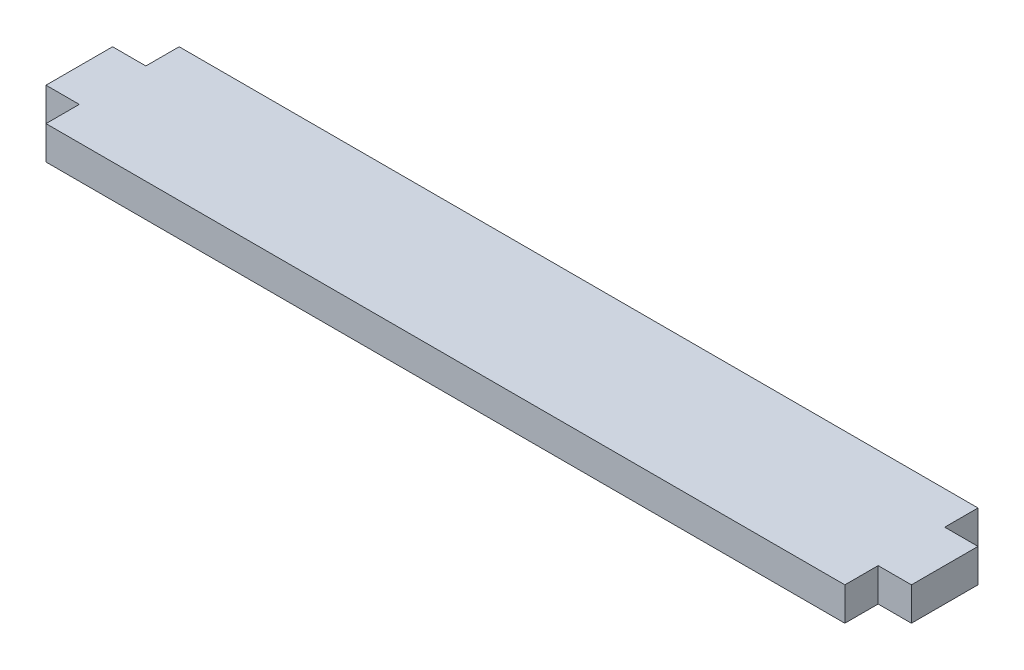
ISO-10303-21;
HEADER;
FILE_DESCRIPTION(('STEP AP214'),'2;1');
FILE_NAME('part.step','',(''),(''),'','','');
FILE_SCHEMA(('AUTOMOTIVE_DESIGN { 1 0 10303 214 1 1 1 1 }'));
ENDSEC;
DATA;
#1=APPLICATION_CONTEXT('core data for automotive mechanical design processes');
#2=APPLICATION_PROTOCOL_DEFINITION('international standard','automotive_design',2000,#1);
#3=PRODUCT_CONTEXT('',#1,'mechanical');
#4=PRODUCT('Part','Part','',(#3));
#5=PRODUCT_RELATED_PRODUCT_CATEGORY('part','',(#4));
#6=PRODUCT_DEFINITION_FORMATION('','',#4);
#7=PRODUCT_DEFINITION_CONTEXT('part definition',#1,'design');
#8=PRODUCT_DEFINITION('design','',#6,#7);
#9=PRODUCT_DEFINITION_SHAPE('','',#8);
#10=(LENGTH_UNIT() NAMED_UNIT(*) SI_UNIT(.MILLI.,.METRE.));
#11=(NAMED_UNIT(*) PLANE_ANGLE_UNIT() SI_UNIT($,.RADIAN.));
#12=(NAMED_UNIT(*) SI_UNIT($,.STERADIAN.) SOLID_ANGLE_UNIT());
#13=UNCERTAINTY_MEASURE_WITH_UNIT(LENGTH_MEASURE(1.E-05),#10,'distance_accuracy_value','');
#14=(GEOMETRIC_REPRESENTATION_CONTEXT(3) GLOBAL_UNCERTAINTY_ASSIGNED_CONTEXT((#13)) GLOBAL_UNIT_ASSIGNED_CONTEXT((#10,
#11,#12)) REPRESENTATION_CONTEXT('',''));
#15=CARTESIAN_POINT('',(0.,0.,0.));
#16=DIRECTION('',(0.,0.,1.));
#17=DIRECTION('',(1.,0.,0.));
#18=AXIS2_PLACEMENT_3D('',#15,#16,#17);
#19=CARTESIAN_POINT('',(152.4,6.35,0.));
#20=DIRECTION('',(-1.,0.,0.));
#21=DIRECTION('',(0.,0.,1.));
#22=AXIS2_PLACEMENT_3D('',#19,#20,#21);
#23=PLANE('',#22);
#24=DIRECTION('',(0.,1.,0.));
#25=VECTOR('',#24,1.);
#26=CARTESIAN_POINT('',(152.4,0.,6.35000000000002));
#27=LINE('',#26,#25);
#28=CARTESIAN_POINT('',(152.4,0.,6.35000000000002));
#29=VERTEX_POINT('',#28);
#30=CARTESIAN_POINT('',(152.4,6.35,6.35000000000002));
#31=VERTEX_POINT('',#30);
#32=EDGE_CURVE('E239',#29,#31,#27,.T.);
#33=ORIENTED_EDGE('',*,*,#32,.F.);
#34=DIRECTION('',(0.,0.,-1.));
#35=VECTOR('',#34,1.);
#36=CARTESIAN_POINT('',(152.4,0.,0.));
#37=LINE('',#36,#35);
#38=CARTESIAN_POINT('',(152.4,0.,0.));
#39=VERTEX_POINT('',#38);
#40=EDGE_CURVE('E157',#29,#39,#37,.T.);
#41=ORIENTED_EDGE('',*,*,#40,.T.);
#42=DIRECTION('',(0.,-1.,0.));
#43=VECTOR('',#42,1.);
#44=CARTESIAN_POINT('',(152.4,6.35,0.));
#45=LINE('',#44,#43);
#46=CARTESIAN_POINT('',(152.4,6.35,0.));
#47=VERTEX_POINT('',#46);
#48=EDGE_CURVE('E171',#47,#39,#45,.T.);
#49=ORIENTED_EDGE('',*,*,#48,.F.);
#50=DIRECTION('',(0.,0.,-1.));
#51=VECTOR('',#50,1.);
#52=CARTESIAN_POINT('',(152.4,6.35,0.));
#53=LINE('',#52,#51);
#54=EDGE_CURVE('E181',#31,#47,#53,.T.);
#55=ORIENTED_EDGE('',*,*,#54,.F.);
#56=EDGE_LOOP('',(#33,#41,#49,#55));
#57=FACE_BOUND('',#56,.T.);
#58=ADVANCED_FACE('F39',(#57),#23,.F.);
#59=CARTESIAN_POINT('',(0.,6.35,0.));
#60=DIRECTION('',(1.,0.,0.));
#61=DIRECTION('',(0.,0.,-1.));
#62=AXIS2_PLACEMENT_3D('',#59,#60,#61);
#63=PLANE('',#62);
#64=DIRECTION('',(0.,1.,0.));
#65=VECTOR('',#64,1.);
#66=CARTESIAN_POINT('',(0.,0.,19.05));
#67=LINE('',#66,#65);
#68=CARTESIAN_POINT('',(0.,0.,19.05));
#69=VERTEX_POINT('',#68);
#70=CARTESIAN_POINT('',(0.,6.35,19.05));
#71=VERTEX_POINT('',#70);
#72=EDGE_CURVE('E205',#69,#71,#67,.T.);
#73=ORIENTED_EDGE('',*,*,#72,.F.);
#74=DIRECTION('',(0.,0.,1.));
#75=VECTOR('',#74,1.);
#76=CARTESIAN_POINT('',(0.,0.,0.));
#77=LINE('',#76,#75);
#78=CARTESIAN_POINT('',(0.,0.,25.4));
#79=VERTEX_POINT('',#78);
#80=EDGE_CURVE('E201',#69,#79,#77,.T.);
#81=ORIENTED_EDGE('',*,*,#80,.T.);
#82=DIRECTION('',(0.,-1.,0.));
#83=VECTOR('',#82,1.);
#84=CARTESIAN_POINT('',(0.,6.35,25.4));
#85=LINE('',#84,#83);
#86=CARTESIAN_POINT('',(0.,6.35,25.4));
#87=VERTEX_POINT('',#86);
#88=EDGE_CURVE('E11',#87,#79,#85,.T.);
#89=ORIENTED_EDGE('',*,*,#88,.F.);
#90=DIRECTION('',(0.,0.,1.));
#91=VECTOR('',#90,1.);
#92=CARTESIAN_POINT('',(0.,6.35,0.));
#93=LINE('',#92,#91);
#94=EDGE_CURVE('E161',#71,#87,#93,.T.);
#95=ORIENTED_EDGE('',*,*,#94,.F.);
#96=EDGE_LOOP('',(#73,#81,#89,#95));
#97=FACE_BOUND('',#96,.T.);
#98=ADVANCED_FACE('F288',(#97),#63,.F.);
#99=CARTESIAN_POINT('',(0.,0.,0.));
#100=VERTEX_POINT('',#99);
#101=CARTESIAN_POINT('',(0.,0.,6.35000000000003));
#102=VERTEX_POINT('',#101);
#103=EDGE_CURVE('E198',#100,#102,#77,.T.);
#104=ORIENTED_EDGE('',*,*,#103,.T.);
#105=DIRECTION('',(0.,1.,0.));
#106=VECTOR('',#105,1.);
#107=CARTESIAN_POINT('',(0.,0.,6.35000000000003));
#108=LINE('',#107,#106);
#109=CARTESIAN_POINT('',(0.,6.35,6.35000000000003));
#110=VERTEX_POINT('',#109);
#111=EDGE_CURVE('E196',#102,#110,#108,.T.);
#112=ORIENTED_EDGE('',*,*,#111,.T.);
#113=CARTESIAN_POINT('',(0.,6.35,0.));
#114=VERTEX_POINT('',#113);
#115=EDGE_CURVE('E186',#114,#110,#93,.T.);
#116=ORIENTED_EDGE('',*,*,#115,.F.);
#117=DIRECTION('',(0.,-1.,0.));
#118=VECTOR('',#117,1.);
#119=CARTESIAN_POINT('',(0.,6.35,0.));
#120=LINE('',#119,#118);
#121=EDGE_CURVE('E167',#114,#100,#120,.T.);
#122=ORIENTED_EDGE('',*,*,#121,.T.);
#123=EDGE_LOOP('',(#104,#112,#116,#122));
#124=FACE_BOUND('',#123,.T.);
#125=ADVANCED_FACE('F41',(#124),#63,.F.);
#126=CARTESIAN_POINT('',(0.,6.35,25.4));
#127=DIRECTION('',(0.,0.,-1.));
#128=DIRECTION('',(-1.,0.,0.));
#129=AXIS2_PLACEMENT_3D('',#126,#127,#128);
#130=PLANE('',#129);
#131=DIRECTION('',(1.,0.,0.));
#132=VECTOR('',#131,1.);
#133=CARTESIAN_POINT('',(0.,0.,25.4));
#134=LINE('',#133,#132);
#135=CARTESIAN_POINT('',(152.4,0.,25.4));
#136=VERTEX_POINT('',#135);
#137=EDGE_CURVE('E163',#79,#136,#134,.T.);
#138=ORIENTED_EDGE('',*,*,#137,.T.);
#139=DIRECTION('',(0.,-1.,0.));
#140=VECTOR('',#139,1.);
#141=CARTESIAN_POINT('',(152.4,6.35,25.4));
#142=LINE('',#141,#140);
#143=CARTESIAN_POINT('',(152.4,6.35,25.4));
#144=VERTEX_POINT('',#143);
#145=EDGE_CURVE('E48',#144,#136,#142,.T.);
#146=ORIENTED_EDGE('',*,*,#145,.F.);
#147=DIRECTION('',(1.,0.,0.));
#148=VECTOR('',#147,1.);
#149=CARTESIAN_POINT('',(0.,6.35,25.4));
#150=LINE('',#149,#148);
#151=EDGE_CURVE('E184',#87,#144,#150,.T.);
#152=ORIENTED_EDGE('',*,*,#151,.F.);
#153=ORIENTED_EDGE('',*,*,#88,.T.);
#154=EDGE_LOOP('',(#138,#146,#152,#153));
#155=FACE_BOUND('',#154,.T.);
#156=ADVANCED_FACE('F276',(#155),#130,.F.);
#157=CARTESIAN_POINT('',(152.4,0.,19.05));
#158=VERTEX_POINT('',#157);
#159=EDGE_CURVE('E136',#136,#158,#37,.T.);
#160=ORIENTED_EDGE('',*,*,#159,.T.);
#161=DIRECTION('',(0.,1.,0.));
#162=VECTOR('',#161,1.);
#163=CARTESIAN_POINT('',(152.4,0.,19.05));
#164=LINE('',#163,#162);
#165=CARTESIAN_POINT('',(152.4,6.35,19.05));
#166=VERTEX_POINT('',#165);
#167=EDGE_CURVE('E143',#158,#166,#164,.T.);
#168=ORIENTED_EDGE('',*,*,#167,.T.);
#169=EDGE_CURVE('E178',#144,#166,#53,.T.);
#170=ORIENTED_EDGE('',*,*,#169,.F.);
#171=ORIENTED_EDGE('',*,*,#145,.T.);
#172=EDGE_LOOP('',(#160,#168,#170,#171));
#173=FACE_BOUND('',#172,.T.);
#174=ADVANCED_FACE('F153',(#173),#23,.F.);
#175=CARTESIAN_POINT('',(0.,6.35,0.));
#176=DIRECTION('',(0.,0.,1.));
#177=DIRECTION('',(1.,0.,0.));
#178=AXIS2_PLACEMENT_3D('',#175,#176,#177);
#179=PLANE('',#178);
#180=DIRECTION('',(-1.,0.,0.));
#181=VECTOR('',#180,1.);
#182=CARTESIAN_POINT('',(0.,0.,0.));
#183=LINE('',#182,#181);
#184=EDGE_CURVE('E156',#39,#100,#183,.T.);
#185=ORIENTED_EDGE('',*,*,#184,.T.);
#186=ORIENTED_EDGE('',*,*,#121,.F.);
#187=DIRECTION('',(-1.,0.,0.));
#188=VECTOR('',#187,1.);
#189=CARTESIAN_POINT('',(0.,6.35,0.));
#190=LINE('',#189,#188);
#191=EDGE_CURVE('E172',#47,#114,#190,.T.);
#192=ORIENTED_EDGE('',*,*,#191,.F.);
#193=ORIENTED_EDGE('',*,*,#48,.T.);
#194=EDGE_LOOP('',(#185,#186,#192,#193));
#195=FACE_BOUND('',#194,.T.);
#196=ADVANCED_FACE('F283',(#195),#179,.F.);
#197=CARTESIAN_POINT('',(0.,6.35,0.));
#198=DIRECTION('',(0.,1.,0.));
#199=DIRECTION('',(0.,0.,1.));
#200=AXIS2_PLACEMENT_3D('',#197,#198,#199);
#201=PLANE('',#200);
#202=ORIENTED_EDGE('',*,*,#115,.T.);
#203=DIRECTION('',(-1.,0.,0.));
#204=VECTOR('',#203,1.);
#205=CARTESIAN_POINT('',(0.,6.35,6.35000000000003));
#206=LINE('',#205,#204);
#207=CARTESIAN_POINT('',(-6.35,6.35,6.35000000000004));
#208=VERTEX_POINT('',#207);
#209=EDGE_CURVE('E63',#110,#208,#206,.T.);
#210=ORIENTED_EDGE('',*,*,#209,.T.);
#211=DIRECTION('',(0.,0.,1.));
#212=VECTOR('',#211,1.);
#213=CARTESIAN_POINT('',(-6.35,6.35,6.35000000000004));
#214=LINE('',#213,#212);
#215=CARTESIAN_POINT('',(-6.35,6.35,19.05));
#216=VERTEX_POINT('',#215);
#217=EDGE_CURVE('E238',#208,#216,#214,.T.);
#218=ORIENTED_EDGE('',*,*,#217,.T.);
#219=DIRECTION('',(1.,0.,0.));
#220=VECTOR('',#219,1.);
#221=CARTESIAN_POINT('',(0.,6.35,19.05));
#222=LINE('',#221,#220);
#223=EDGE_CURVE('E219',#216,#71,#222,.T.);
#224=ORIENTED_EDGE('',*,*,#223,.T.);
#225=ORIENTED_EDGE('',*,*,#94,.T.);
#226=ORIENTED_EDGE('',*,*,#151,.T.);
#227=ORIENTED_EDGE('',*,*,#169,.T.);
#228=DIRECTION('',(-1.,0.,0.));
#229=VECTOR('',#228,1.);
#230=CARTESIAN_POINT('',(152.4,6.35,19.05));
#231=LINE('',#230,#229);
#232=CARTESIAN_POINT('',(158.75,6.35,19.05));
#233=VERTEX_POINT('',#232);
#234=EDGE_CURVE('E55',#233,#166,#231,.T.);
#235=ORIENTED_EDGE('',*,*,#234,.F.);
#236=DIRECTION('',(0.,0.,1.));
#237=VECTOR('',#236,1.);
#238=CARTESIAN_POINT('',(158.75,6.35,6.35000000000003));
#239=LINE('',#238,#237);
#240=CARTESIAN_POINT('',(158.75,6.35,6.35000000000003));
#241=VERTEX_POINT('',#240);
#242=EDGE_CURVE('E257',#241,#233,#239,.T.);
#243=ORIENTED_EDGE('',*,*,#242,.F.);
#244=DIRECTION('',(1.,0.,0.));
#245=VECTOR('',#244,1.);
#246=CARTESIAN_POINT('',(152.4,6.35,6.35000000000002));
#247=LINE('',#246,#245);
#248=EDGE_CURVE('E141',#31,#241,#247,.T.);
#249=ORIENTED_EDGE('',*,*,#248,.F.);
#250=ORIENTED_EDGE('',*,*,#54,.T.);
#251=ORIENTED_EDGE('',*,*,#191,.T.);
#252=EDGE_LOOP('',(#202,#210,#218,#224,#225,#226,#227,#235,#243,#249,#250,#251));
#253=FACE_BOUND('',#252,.T.);
#254=ADVANCED_FACE('F274',(#253),#201,.T.);
#255=CARTESIAN_POINT('',(0.,0.,0.));
#256=DIRECTION('',(0.,1.,0.));
#257=DIRECTION('',(0.,0.,1.));
#258=AXIS2_PLACEMENT_3D('',#255,#256,#257);
#259=PLANE('',#258);
#260=ORIENTED_EDGE('',*,*,#103,.F.);
#261=ORIENTED_EDGE('',*,*,#184,.F.);
#262=ORIENTED_EDGE('',*,*,#40,.F.);
#263=DIRECTION('',(1.,0.,0.));
#264=VECTOR('',#263,1.);
#265=CARTESIAN_POINT('',(152.4,0.,6.35000000000002));
#266=LINE('',#265,#264);
#267=CARTESIAN_POINT('',(158.75,0.,6.35000000000003));
#268=VERTEX_POINT('',#267);
#269=EDGE_CURVE('E150',#29,#268,#266,.T.);
#270=ORIENTED_EDGE('',*,*,#269,.T.);
#271=DIRECTION('',(0.,0.,1.));
#272=VECTOR('',#271,1.);
#273=CARTESIAN_POINT('',(158.75,0.,6.35000000000003));
#274=LINE('',#273,#272);
#275=CARTESIAN_POINT('',(158.75,0.,19.05));
#276=VERTEX_POINT('',#275);
#277=EDGE_CURVE('E138',#268,#276,#274,.T.);
#278=ORIENTED_EDGE('',*,*,#277,.T.);
#279=DIRECTION('',(-1.,0.,0.));
#280=VECTOR('',#279,1.);
#281=CARTESIAN_POINT('',(152.4,0.,19.05));
#282=LINE('',#281,#280);
#283=EDGE_CURVE('E131',#276,#158,#282,.T.);
#284=ORIENTED_EDGE('',*,*,#283,.T.);
#285=ORIENTED_EDGE('',*,*,#159,.F.);
#286=ORIENTED_EDGE('',*,*,#137,.F.);
#287=ORIENTED_EDGE('',*,*,#80,.F.);
#288=DIRECTION('',(1.,0.,0.));
#289=VECTOR('',#288,1.);
#290=CARTESIAN_POINT('',(0.,0.,19.05));
#291=LINE('',#290,#289);
#292=CARTESIAN_POINT('',(-6.35,0.,19.05));
#293=VERTEX_POINT('',#292);
#294=EDGE_CURVE('E225',#293,#69,#291,.T.);
#295=ORIENTED_EDGE('',*,*,#294,.F.);
#296=DIRECTION('',(0.,0.,1.));
#297=VECTOR('',#296,1.);
#298=CARTESIAN_POINT('',(-6.35,0.,6.35000000000004));
#299=LINE('',#298,#297);
#300=CARTESIAN_POINT('',(-6.35,0.,6.35000000000004));
#301=VERTEX_POINT('',#300);
#302=EDGE_CURVE('E228',#301,#293,#299,.T.);
#303=ORIENTED_EDGE('',*,*,#302,.F.);
#304=DIRECTION('',(-1.,0.,0.));
#305=VECTOR('',#304,1.);
#306=CARTESIAN_POINT('',(0.,0.,6.35000000000003));
#307=LINE('',#306,#305);
#308=EDGE_CURVE('E233',#102,#301,#307,.T.);
#309=ORIENTED_EDGE('',*,*,#308,.F.);
#310=EDGE_LOOP('',(#260,#261,#262,#270,#278,#284,#285,#286,#287,#295,#303,#309));
#311=FACE_BOUND('',#310,.T.);
#312=ADVANCED_FACE('F133',(#311),#259,.F.);
#313=CARTESIAN_POINT('',(0.,0.,19.05));
#314=DIRECTION('',(0.,0.,1.));
#315=DIRECTION('',(1.,0.,0.));
#316=AXIS2_PLACEMENT_3D('',#313,#314,#315);
#317=PLANE('',#316);
#318=ORIENTED_EDGE('',*,*,#223,.F.);
#319=DIRECTION('',(0.,1.,0.));
#320=VECTOR('',#319,1.);
#321=CARTESIAN_POINT('',(-6.35,0.,19.05));
#322=LINE('',#321,#320);
#323=EDGE_CURVE('E211',#293,#216,#322,.T.);
#324=ORIENTED_EDGE('',*,*,#323,.F.);
#325=ORIENTED_EDGE('',*,*,#294,.T.);
#326=ORIENTED_EDGE('',*,*,#72,.T.);
#327=EDGE_LOOP('',(#318,#324,#325,#326));
#328=FACE_BOUND('',#327,.T.);
#329=ADVANCED_FACE('F348',(#328),#317,.T.);
#330=CARTESIAN_POINT('',(-6.35,0.,6.35000000000004));
#331=DIRECTION('',(-1.,0.,0.));
#332=DIRECTION('',(0.,0.,1.));
#333=AXIS2_PLACEMENT_3D('',#330,#331,#332);
#334=PLANE('',#333);
#335=ORIENTED_EDGE('',*,*,#217,.F.);
#336=DIRECTION('',(0.,1.,0.));
#337=VECTOR('',#336,1.);
#338=CARTESIAN_POINT('',(-6.35,0.,6.35000000000004));
#339=LINE('',#338,#337);
#340=EDGE_CURVE('E216',#301,#208,#339,.T.);
#341=ORIENTED_EDGE('',*,*,#340,.F.);
#342=ORIENTED_EDGE('',*,*,#302,.T.);
#343=ORIENTED_EDGE('',*,*,#323,.T.);
#344=EDGE_LOOP('',(#335,#341,#342,#343));
#345=FACE_BOUND('',#344,.T.);
#346=ADVANCED_FACE('F279',(#345),#334,.T.);
#347=CARTESIAN_POINT('',(0.,0.,6.35000000000003));
#348=DIRECTION('',(0.,0.,-1.));
#349=DIRECTION('',(-1.,0.,0.));
#350=AXIS2_PLACEMENT_3D('',#347,#348,#349);
#351=PLANE('',#350);
#352=ORIENTED_EDGE('',*,*,#209,.F.);
#353=ORIENTED_EDGE('',*,*,#111,.F.);
#354=ORIENTED_EDGE('',*,*,#308,.T.);
#355=ORIENTED_EDGE('',*,*,#340,.T.);
#356=EDGE_LOOP('',(#352,#353,#354,#355));
#357=FACE_BOUND('',#356,.T.);
#358=ADVANCED_FACE('F359',(#357),#351,.T.);
#359=CARTESIAN_POINT('',(152.4,0.,6.35000000000002));
#360=DIRECTION('',(0.,0.,1.));
#361=DIRECTION('',(1.,0.,0.));
#362=AXIS2_PLACEMENT_3D('',#359,#360,#361);
#363=PLANE('',#362);
#364=ORIENTED_EDGE('',*,*,#248,.T.);
#365=DIRECTION('',(0.,1.,0.));
#366=VECTOR('',#365,1.);
#367=CARTESIAN_POINT('',(158.75,0.,6.35000000000003));
#368=LINE('',#367,#366);
#369=EDGE_CURVE('E248',#268,#241,#368,.T.);
#370=ORIENTED_EDGE('',*,*,#369,.F.);
#371=ORIENTED_EDGE('',*,*,#269,.F.);
#372=ORIENTED_EDGE('',*,*,#32,.T.);
#373=EDGE_LOOP('',(#364,#370,#371,#372));
#374=FACE_BOUND('',#373,.T.);
#375=ADVANCED_FACE('F270',(#374),#363,.F.);
#376=CARTESIAN_POINT('',(158.75,0.,6.35000000000003));
#377=DIRECTION('',(-1.,0.,0.));
#378=DIRECTION('',(0.,0.,1.));
#379=AXIS2_PLACEMENT_3D('',#376,#377,#378);
#380=PLANE('',#379);
#381=ORIENTED_EDGE('',*,*,#242,.T.);
#382=DIRECTION('',(0.,1.,0.));
#383=VECTOR('',#382,1.);
#384=CARTESIAN_POINT('',(158.75,0.,19.05));
#385=LINE('',#384,#383);
#386=EDGE_CURVE('E149',#276,#233,#385,.T.);
#387=ORIENTED_EDGE('',*,*,#386,.F.);
#388=ORIENTED_EDGE('',*,*,#277,.F.);
#389=ORIENTED_EDGE('',*,*,#369,.T.);
#390=EDGE_LOOP('',(#381,#387,#388,#389));
#391=FACE_BOUND('',#390,.T.);
#392=ADVANCED_FACE('F273',(#391),#380,.F.);
#393=CARTESIAN_POINT('',(152.4,0.,19.05));
#394=DIRECTION('',(0.,0.,-1.));
#395=DIRECTION('',(-1.,0.,0.));
#396=AXIS2_PLACEMENT_3D('',#393,#394,#395);
#397=PLANE('',#396);
#398=ORIENTED_EDGE('',*,*,#234,.T.);
#399=ORIENTED_EDGE('',*,*,#167,.F.);
#400=ORIENTED_EDGE('',*,*,#283,.F.);
#401=ORIENTED_EDGE('',*,*,#386,.T.);
#402=EDGE_LOOP('',(#398,#399,#400,#401));
#403=FACE_BOUND('',#402,.T.);
#404=ADVANCED_FACE('F144',(#403),#397,.F.);
#405=CLOSED_SHELL('',(#58,#98,#125,#156,#174,#196,#254,#312,#329,#346,#358,#375,#392,#404));
#406=MANIFOLD_SOLID_BREP('B2',#405);
#407=ADVANCED_BREP_SHAPE_REPRESENTATION('',(#18,#406),#14);
#408=SHAPE_DEFINITION_REPRESENTATION(#9,#407);
ENDSEC;
END-ISO-10303-21;
